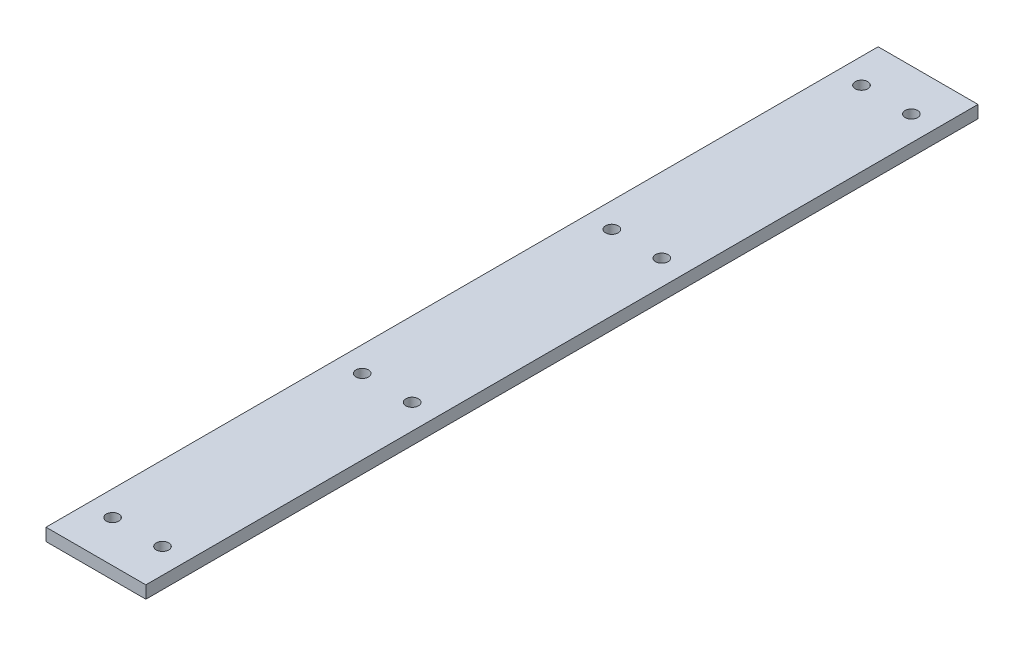
ISO-10303-21;
HEADER;
FILE_DESCRIPTION(('STEP AP214'),'2;1');
FILE_NAME('part.step','',(''),(''),'','','');
FILE_SCHEMA(('AUTOMOTIVE_DESIGN { 1 0 10303 214 1 1 1 1 }'));
ENDSEC;
DATA;
#1=APPLICATION_CONTEXT('core data for automotive mechanical design processes');
#2=APPLICATION_PROTOCOL_DEFINITION('international standard','automotive_design',2000,#1);
#3=PRODUCT_CONTEXT('',#1,'mechanical');
#4=PRODUCT('Part','Part','',(#3));
#5=PRODUCT_RELATED_PRODUCT_CATEGORY('part','',(#4));
#6=PRODUCT_DEFINITION_FORMATION('','',#4);
#7=PRODUCT_DEFINITION_CONTEXT('part definition',#1,'design');
#8=PRODUCT_DEFINITION('design','',#6,#7);
#9=PRODUCT_DEFINITION_SHAPE('','',#8);
#10=(LENGTH_UNIT() NAMED_UNIT(*) SI_UNIT(.MILLI.,.METRE.));
#11=(NAMED_UNIT(*) PLANE_ANGLE_UNIT() SI_UNIT($,.RADIAN.));
#12=(NAMED_UNIT(*) SI_UNIT($,.STERADIAN.) SOLID_ANGLE_UNIT());
#13=UNCERTAINTY_MEASURE_WITH_UNIT(LENGTH_MEASURE(1.E-05),#10,'distance_accuracy_value','');
#14=(GEOMETRIC_REPRESENTATION_CONTEXT(3) GLOBAL_UNCERTAINTY_ASSIGNED_CONTEXT((#13)) GLOBAL_UNIT_ASSIGNED_CONTEXT((#10,
#11,#12)) REPRESENTATION_CONTEXT('',''));
#15=CARTESIAN_POINT('',(0.,0.,0.));
#16=DIRECTION('',(0.,0.,1.));
#17=DIRECTION('',(1.,0.,0.));
#18=AXIS2_PLACEMENT_3D('',#15,#16,#17);
#19=CARTESIAN_POINT('',(0.,0.,0.));
#20=DIRECTION('',(0.,1.,0.));
#21=DIRECTION('',(1.,0.,0.));
#22=AXIS2_PLACEMENT_3D('',#19,#20,#21);
#23=PLANE('',#22);
#24=DIRECTION('',(0.,0.,-1.));
#25=VECTOR('',#24,1.);
#26=CARTESIAN_POINT('',(12.,0.,100.));
#27=LINE('',#26,#25);
#28=CARTESIAN_POINT('',(12.,0.,100.));
#29=VERTEX_POINT('',#28);
#30=CARTESIAN_POINT('',(12.,0.,-100.));
#31=VERTEX_POINT('',#30);
#32=EDGE_CURVE('E138',#29,#31,#27,.T.);
#33=ORIENTED_EDGE('',*,*,#32,.T.);
#34=DIRECTION('',(-1.,0.,0.));
#35=VECTOR('',#34,1.);
#36=CARTESIAN_POINT('',(12.,0.,-100.));
#37=LINE('',#36,#35);
#38=CARTESIAN_POINT('',(-12.,0.,-100.));
#39=VERTEX_POINT('',#38);
#40=EDGE_CURVE('E181',#31,#39,#37,.T.);
#41=ORIENTED_EDGE('',*,*,#40,.T.);
#42=DIRECTION('',(0.,0.,1.));
#43=VECTOR('',#42,1.);
#44=CARTESIAN_POINT('',(-12.,0.,-100.));
#45=LINE('',#44,#43);
#46=CARTESIAN_POINT('',(-12.,0.,100.));
#47=VERTEX_POINT('',#46);
#48=EDGE_CURVE('E139',#39,#47,#45,.T.);
#49=ORIENTED_EDGE('',*,*,#48,.T.);
#50=DIRECTION('',(1.,0.,0.));
#51=VECTOR('',#50,1.);
#52=CARTESIAN_POINT('',(-12.,0.,100.));
#53=LINE('',#52,#51);
#54=EDGE_CURVE('E26',#47,#29,#53,.T.);
#55=ORIENTED_EDGE('',*,*,#54,.T.);
#56=EDGE_LOOP('',(#33,#41,#49,#55));
#57=FACE_BOUND('',#56,.T.);
#58=CARTESIAN_POINT('',(6.,0.,-30.));
#59=DIRECTION('',(0.,-1.,0.));
#60=DIRECTION('',(1.,0.,0.));
#61=AXIS2_PLACEMENT_3D('',#58,#59,#60);
#62=CIRCLE('',#61,1.5);
#63=CARTESIAN_POINT('',(7.5,0.,-30.));
#64=VERTEX_POINT('',#63);
#65=EDGE_CURVE('E165',#64,#64,#62,.T.);
#66=ORIENTED_EDGE('',*,*,#65,.T.);
#67=EDGE_LOOP('',(#66));
#68=FACE_BOUND('',#67,.T.);
#69=CARTESIAN_POINT('',(6.,0.,30.));
#70=DIRECTION('',(0.,-1.,0.));
#71=DIRECTION('',(1.,0.,0.));
#72=AXIS2_PLACEMENT_3D('',#69,#70,#71);
#73=CIRCLE('',#72,1.5);
#74=CARTESIAN_POINT('',(7.5,0.,30.));
#75=VERTEX_POINT('',#74);
#76=EDGE_CURVE('E200',#75,#75,#73,.T.);
#77=ORIENTED_EDGE('',*,*,#76,.T.);
#78=EDGE_LOOP('',(#77));
#79=FACE_BOUND('',#78,.T.);
#80=CARTESIAN_POINT('',(6.,0.,90.));
#81=DIRECTION('',(0.,-1.,0.));
#82=DIRECTION('',(1.,0.,0.));
#83=AXIS2_PLACEMENT_3D('',#80,#81,#82);
#84=CIRCLE('',#83,1.5);
#85=CARTESIAN_POINT('',(7.5,0.,90.));
#86=VERTEX_POINT('',#85);
#87=EDGE_CURVE('E172',#86,#86,#84,.T.);
#88=ORIENTED_EDGE('',*,*,#87,.T.);
#89=EDGE_LOOP('',(#88));
#90=FACE_BOUND('',#89,.T.);
#91=CARTESIAN_POINT('',(6.,0.,-90.));
#92=DIRECTION('',(0.,-1.,0.));
#93=DIRECTION('',(1.,0.,0.));
#94=AXIS2_PLACEMENT_3D('',#91,#92,#93);
#95=CIRCLE('',#94,1.5);
#96=CARTESIAN_POINT('',(7.5,0.,-90.));
#97=VERTEX_POINT('',#96);
#98=EDGE_CURVE('E207',#97,#97,#95,.T.);
#99=ORIENTED_EDGE('',*,*,#98,.T.);
#100=EDGE_LOOP('',(#99));
#101=FACE_BOUND('',#100,.T.);
#102=CARTESIAN_POINT('',(-6.,0.,90.));
#103=DIRECTION('',(0.,-1.,0.));
#104=DIRECTION('',(1.,0.,0.));
#105=AXIS2_PLACEMENT_3D('',#102,#103,#104);
#106=CIRCLE('',#105,1.5);
#107=CARTESIAN_POINT('',(-4.5,0.,90.));
#108=VERTEX_POINT('',#107);
#109=EDGE_CURVE('E213',#108,#108,#106,.T.);
#110=ORIENTED_EDGE('',*,*,#109,.T.);
#111=EDGE_LOOP('',(#110));
#112=FACE_BOUND('',#111,.T.);
#113=CARTESIAN_POINT('',(-6.,0.,30.));
#114=DIRECTION('',(0.,-1.,0.));
#115=DIRECTION('',(1.,0.,0.));
#116=AXIS2_PLACEMENT_3D('',#113,#114,#115);
#117=CIRCLE('',#116,1.5);
#118=CARTESIAN_POINT('',(-4.5,0.,30.));
#119=VERTEX_POINT('',#118);
#120=EDGE_CURVE('E219',#119,#119,#117,.T.);
#121=ORIENTED_EDGE('',*,*,#120,.T.);
#122=EDGE_LOOP('',(#121));
#123=FACE_BOUND('',#122,.T.);
#124=CARTESIAN_POINT('',(-6.,0.,-30.));
#125=DIRECTION('',(0.,-1.,0.));
#126=DIRECTION('',(1.,0.,0.));
#127=AXIS2_PLACEMENT_3D('',#124,#125,#126);
#128=CIRCLE('',#127,1.5);
#129=CARTESIAN_POINT('',(-4.5,0.,-30.));
#130=VERTEX_POINT('',#129);
#131=EDGE_CURVE('E225',#130,#130,#128,.T.);
#132=ORIENTED_EDGE('',*,*,#131,.T.);
#133=EDGE_LOOP('',(#132));
#134=FACE_BOUND('',#133,.T.);
#135=CARTESIAN_POINT('',(-6.,0.,-90.));
#136=DIRECTION('',(0.,-1.,0.));
#137=DIRECTION('',(1.,0.,0.));
#138=AXIS2_PLACEMENT_3D('',#135,#136,#137);
#139=CIRCLE('',#138,1.5);
#140=CARTESIAN_POINT('',(-4.5,0.,-90.));
#141=VERTEX_POINT('',#140);
#142=EDGE_CURVE('E36',#141,#141,#139,.T.);
#143=ORIENTED_EDGE('',*,*,#142,.T.);
#144=EDGE_LOOP('',(#143));
#145=FACE_BOUND('',#144,.T.);
#146=ADVANCED_FACE('F17',(#57,#68,#79,#90,#101,#112,#123,#134,#145),#23,.T.);
#147=CARTESIAN_POINT('',(0.,-3.,0.));
#148=DIRECTION('',(0.,1.,0.));
#149=DIRECTION('',(1.,0.,0.));
#150=AXIS2_PLACEMENT_3D('',#147,#148,#149);
#151=PLANE('',#150);
#152=DIRECTION('',(0.,0.,-1.));
#153=VECTOR('',#152,1.);
#154=CARTESIAN_POINT('',(12.,-3.,100.));
#155=LINE('',#154,#153);
#156=CARTESIAN_POINT('',(12.,-3.,100.));
#157=VERTEX_POINT('',#156);
#158=CARTESIAN_POINT('',(12.,-3.,-100.));
#159=VERTEX_POINT('',#158);
#160=EDGE_CURVE('E151',#157,#159,#155,.T.);
#161=ORIENTED_EDGE('',*,*,#160,.F.);
#162=DIRECTION('',(1.,0.,0.));
#163=VECTOR('',#162,1.);
#164=CARTESIAN_POINT('',(-12.,-3.,100.));
#165=LINE('',#164,#163);
#166=CARTESIAN_POINT('',(-12.,-3.,100.));
#167=VERTEX_POINT('',#166);
#168=EDGE_CURVE('E11',#167,#157,#165,.T.);
#169=ORIENTED_EDGE('',*,*,#168,.F.);
#170=DIRECTION('',(0.,0.,1.));
#171=VECTOR('',#170,1.);
#172=CARTESIAN_POINT('',(-12.,-3.,-100.));
#173=LINE('',#172,#171);
#174=CARTESIAN_POINT('',(-12.,-3.,-100.));
#175=VERTEX_POINT('',#174);
#176=EDGE_CURVE('E191',#175,#167,#173,.T.);
#177=ORIENTED_EDGE('',*,*,#176,.F.);
#178=DIRECTION('',(-1.,0.,0.));
#179=VECTOR('',#178,1.);
#180=CARTESIAN_POINT('',(12.,-3.,-100.));
#181=LINE('',#180,#179);
#182=EDGE_CURVE('E176',#159,#175,#181,.T.);
#183=ORIENTED_EDGE('',*,*,#182,.F.);
#184=EDGE_LOOP('',(#161,#169,#177,#183));
#185=FACE_BOUND('',#184,.T.);
#186=CARTESIAN_POINT('',(6.,-3.,-30.));
#187=DIRECTION('',(0.,-1.,0.));
#188=DIRECTION('',(1.,0.,0.));
#189=AXIS2_PLACEMENT_3D('',#186,#187,#188);
#190=CIRCLE('',#189,1.5);
#191=CARTESIAN_POINT('',(7.5,-3.,-30.));
#192=VERTEX_POINT('',#191);
#193=EDGE_CURVE('E169',#192,#192,#190,.T.);
#194=ORIENTED_EDGE('',*,*,#193,.F.);
#195=EDGE_LOOP('',(#194));
#196=FACE_BOUND('',#195,.T.);
#197=CARTESIAN_POINT('',(6.,-3.,30.));
#198=DIRECTION('',(0.,-1.,0.));
#199=DIRECTION('',(1.,0.,0.));
#200=AXIS2_PLACEMENT_3D('',#197,#198,#199);
#201=CIRCLE('',#200,1.5);
#202=CARTESIAN_POINT('',(7.5,-3.,30.));
#203=VERTEX_POINT('',#202);
#204=EDGE_CURVE('E168',#203,#203,#201,.T.);
#205=ORIENTED_EDGE('',*,*,#204,.F.);
#206=EDGE_LOOP('',(#205));
#207=FACE_BOUND('',#206,.T.);
#208=CARTESIAN_POINT('',(6.,-3.,90.));
#209=DIRECTION('',(0.,-1.,0.));
#210=DIRECTION('',(1.,0.,0.));
#211=AXIS2_PLACEMENT_3D('',#208,#209,#210);
#212=CIRCLE('',#211,1.5);
#213=CARTESIAN_POINT('',(7.5,-3.,90.));
#214=VERTEX_POINT('',#213);
#215=EDGE_CURVE('E163',#214,#214,#212,.T.);
#216=ORIENTED_EDGE('',*,*,#215,.F.);
#217=EDGE_LOOP('',(#216));
#218=FACE_BOUND('',#217,.T.);
#219=CARTESIAN_POINT('',(6.,-3.,-90.));
#220=DIRECTION('',(0.,-1.,0.));
#221=DIRECTION('',(1.,0.,0.));
#222=AXIS2_PLACEMENT_3D('',#219,#220,#221);
#223=CIRCLE('',#222,1.5);
#224=CARTESIAN_POINT('',(7.5,-3.,-90.));
#225=VERTEX_POINT('',#224);
#226=EDGE_CURVE('E175',#225,#225,#223,.T.);
#227=ORIENTED_EDGE('',*,*,#226,.F.);
#228=EDGE_LOOP('',(#227));
#229=FACE_BOUND('',#228,.T.);
#230=CARTESIAN_POINT('',(-6.,-3.,90.));
#231=DIRECTION('',(0.,-1.,0.));
#232=DIRECTION('',(1.,0.,0.));
#233=AXIS2_PLACEMENT_3D('',#230,#231,#232);
#234=CIRCLE('',#233,1.5);
#235=CARTESIAN_POINT('',(-4.5,-3.,90.));
#236=VERTEX_POINT('',#235);
#237=EDGE_CURVE('E210',#236,#236,#234,.T.);
#238=ORIENTED_EDGE('',*,*,#237,.F.);
#239=EDGE_LOOP('',(#238));
#240=FACE_BOUND('',#239,.T.);
#241=CARTESIAN_POINT('',(-6.,-3.,30.));
#242=DIRECTION('',(0.,-1.,0.));
#243=DIRECTION('',(1.,0.,0.));
#244=AXIS2_PLACEMENT_3D('',#241,#242,#243);
#245=CIRCLE('',#244,1.5);
#246=CARTESIAN_POINT('',(-4.5,-3.,30.));
#247=VERTEX_POINT('',#246);
#248=EDGE_CURVE('E216',#247,#247,#245,.T.);
#249=ORIENTED_EDGE('',*,*,#248,.F.);
#250=EDGE_LOOP('',(#249));
#251=FACE_BOUND('',#250,.T.);
#252=CARTESIAN_POINT('',(-6.,-3.,-30.));
#253=DIRECTION('',(0.,-1.,0.));
#254=DIRECTION('',(1.,0.,0.));
#255=AXIS2_PLACEMENT_3D('',#252,#253,#254);
#256=CIRCLE('',#255,1.5);
#257=CARTESIAN_POINT('',(-4.5,-3.,-30.));
#258=VERTEX_POINT('',#257);
#259=EDGE_CURVE('E222',#258,#258,#256,.T.);
#260=ORIENTED_EDGE('',*,*,#259,.F.);
#261=EDGE_LOOP('',(#260));
#262=FACE_BOUND('',#261,.T.);
#263=CARTESIAN_POINT('',(-6.,-3.,-90.));
#264=DIRECTION('',(0.,-1.,0.));
#265=DIRECTION('',(1.,0.,0.));
#266=AXIS2_PLACEMENT_3D('',#263,#264,#265);
#267=CIRCLE('',#266,1.5);
#268=CARTESIAN_POINT('',(-4.5,-3.,-90.));
#269=VERTEX_POINT('',#268);
#270=EDGE_CURVE('E43',#269,#269,#267,.T.);
#271=ORIENTED_EDGE('',*,*,#270,.F.);
#272=EDGE_LOOP('',(#271));
#273=FACE_BOUND('',#272,.T.);
#274=ADVANCED_FACE('F19',(#185,#196,#207,#218,#229,#240,#251,#262,#273),#151,.F.);
#275=CARTESIAN_POINT('',(-12.,-3.,100.));
#276=DIRECTION('',(0.,0.,1.));
#277=DIRECTION('',(1.,0.,0.));
#278=AXIS2_PLACEMENT_3D('',#275,#276,#277);
#279=PLANE('',#278);
#280=ORIENTED_EDGE('',*,*,#54,.F.);
#281=DIRECTION('',(0.,1.,0.));
#282=VECTOR('',#281,1.);
#283=CARTESIAN_POINT('',(-12.,-3.,100.));
#284=LINE('',#283,#282);
#285=EDGE_CURVE('E195',#167,#47,#284,.T.);
#286=ORIENTED_EDGE('',*,*,#285,.F.);
#287=ORIENTED_EDGE('',*,*,#168,.T.);
#288=DIRECTION('',(0.,1.,0.));
#289=VECTOR('',#288,1.);
#290=CARTESIAN_POINT('',(12.,-3.,100.));
#291=LINE('',#290,#289);
#292=EDGE_CURVE('E145',#157,#29,#291,.T.);
#293=ORIENTED_EDGE('',*,*,#292,.T.);
#294=EDGE_LOOP('',(#280,#286,#287,#293));
#295=FACE_BOUND('',#294,.T.);
#296=ADVANCED_FACE('F146',(#295),#279,.T.);
#297=CARTESIAN_POINT('',(-6.,-3.,-90.));
#298=DIRECTION('',(0.,1.,0.));
#299=DIRECTION('',(0.,0.,1.));
#300=AXIS2_PLACEMENT_3D('',#297,#298,#299);
#301=CYLINDRICAL_SURFACE('',#300,1.5);
#302=ORIENTED_EDGE('',*,*,#142,.F.);
#303=EDGE_LOOP('',(#302));
#304=FACE_BOUND('',#303,.T.);
#305=ORIENTED_EDGE('',*,*,#270,.T.);
#306=EDGE_LOOP('',(#305));
#307=FACE_BOUND('',#306,.T.);
#308=ADVANCED_FACE('F332',(#304,#307),#301,.F.);
#309=CARTESIAN_POINT('',(-6.,-3.,-30.));
#310=DIRECTION('',(0.,1.,0.));
#311=DIRECTION('',(0.,0.,1.));
#312=AXIS2_PLACEMENT_3D('',#309,#310,#311);
#313=CYLINDRICAL_SURFACE('',#312,1.5);
#314=ORIENTED_EDGE('',*,*,#131,.F.);
#315=EDGE_LOOP('',(#314));
#316=FACE_BOUND('',#315,.T.);
#317=ORIENTED_EDGE('',*,*,#259,.T.);
#318=EDGE_LOOP('',(#317));
#319=FACE_BOUND('',#318,.T.);
#320=ADVANCED_FACE('F329',(#316,#319),#313,.F.);
#321=CARTESIAN_POINT('',(-6.,-3.,30.));
#322=DIRECTION('',(0.,1.,0.));
#323=DIRECTION('',(0.,0.,1.));
#324=AXIS2_PLACEMENT_3D('',#321,#322,#323);
#325=CYLINDRICAL_SURFACE('',#324,1.5);
#326=ORIENTED_EDGE('',*,*,#120,.F.);
#327=EDGE_LOOP('',(#326));
#328=FACE_BOUND('',#327,.T.);
#329=ORIENTED_EDGE('',*,*,#248,.T.);
#330=EDGE_LOOP('',(#329));
#331=FACE_BOUND('',#330,.T.);
#332=ADVANCED_FACE('F331',(#328,#331),#325,.F.);
#333=CARTESIAN_POINT('',(-6.,-3.,90.));
#334=DIRECTION('',(0.,1.,0.));
#335=DIRECTION('',(0.,0.,1.));
#336=AXIS2_PLACEMENT_3D('',#333,#334,#335);
#337=CYLINDRICAL_SURFACE('',#336,1.5);
#338=ORIENTED_EDGE('',*,*,#109,.F.);
#339=EDGE_LOOP('',(#338));
#340=FACE_BOUND('',#339,.T.);
#341=ORIENTED_EDGE('',*,*,#237,.T.);
#342=EDGE_LOOP('',(#341));
#343=FACE_BOUND('',#342,.T.);
#344=ADVANCED_FACE('F340',(#340,#343),#337,.F.);
#345=CARTESIAN_POINT('',(6.,-3.,-90.));
#346=DIRECTION('',(0.,1.,0.));
#347=DIRECTION('',(0.,0.,1.));
#348=AXIS2_PLACEMENT_3D('',#345,#346,#347);
#349=CYLINDRICAL_SURFACE('',#348,1.5);
#350=ORIENTED_EDGE('',*,*,#98,.F.);
#351=EDGE_LOOP('',(#350));
#352=FACE_BOUND('',#351,.T.);
#353=ORIENTED_EDGE('',*,*,#226,.T.);
#354=EDGE_LOOP('',(#353));
#355=FACE_BOUND('',#354,.T.);
#356=ADVANCED_FACE('F353',(#352,#355),#349,.F.);
#357=CARTESIAN_POINT('',(6.,-3.,90.));
#358=DIRECTION('',(0.,1.,0.));
#359=DIRECTION('',(0.,0.,1.));
#360=AXIS2_PLACEMENT_3D('',#357,#358,#359);
#361=CYLINDRICAL_SURFACE('',#360,1.5);
#362=ORIENTED_EDGE('',*,*,#87,.F.);
#363=EDGE_LOOP('',(#362));
#364=FACE_BOUND('',#363,.T.);
#365=ORIENTED_EDGE('',*,*,#215,.T.);
#366=EDGE_LOOP('',(#365));
#367=FACE_BOUND('',#366,.T.);
#368=ADVANCED_FACE('F315',(#364,#367),#361,.F.);
#369=CARTESIAN_POINT('',(6.,-3.,30.));
#370=DIRECTION('',(0.,1.,0.));
#371=DIRECTION('',(0.,0.,1.));
#372=AXIS2_PLACEMENT_3D('',#369,#370,#371);
#373=CYLINDRICAL_SURFACE('',#372,1.5);
#374=ORIENTED_EDGE('',*,*,#76,.F.);
#375=EDGE_LOOP('',(#374));
#376=FACE_BOUND('',#375,.T.);
#377=ORIENTED_EDGE('',*,*,#204,.T.);
#378=EDGE_LOOP('',(#377));
#379=FACE_BOUND('',#378,.T.);
#380=ADVANCED_FACE('F370',(#376,#379),#373,.F.);
#381=CARTESIAN_POINT('',(6.,-3.,-30.));
#382=DIRECTION('',(0.,1.,0.));
#383=DIRECTION('',(0.,0.,1.));
#384=AXIS2_PLACEMENT_3D('',#381,#382,#383);
#385=CYLINDRICAL_SURFACE('',#384,1.5);
#386=ORIENTED_EDGE('',*,*,#65,.F.);
#387=EDGE_LOOP('',(#386));
#388=FACE_BOUND('',#387,.T.);
#389=ORIENTED_EDGE('',*,*,#193,.T.);
#390=EDGE_LOOP('',(#389));
#391=FACE_BOUND('',#390,.T.);
#392=ADVANCED_FACE('F376',(#388,#391),#385,.F.);
#393=CARTESIAN_POINT('',(-12.,-3.,-100.));
#394=DIRECTION('',(-1.,0.,0.));
#395=DIRECTION('',(0.,0.,1.));
#396=AXIS2_PLACEMENT_3D('',#393,#394,#395);
#397=PLANE('',#396);
#398=ORIENTED_EDGE('',*,*,#48,.F.);
#399=DIRECTION('',(0.,1.,0.));
#400=VECTOR('',#399,1.);
#401=CARTESIAN_POINT('',(-12.,-3.,-100.));
#402=LINE('',#401,#400);
#403=EDGE_CURVE('E180',#175,#39,#402,.T.);
#404=ORIENTED_EDGE('',*,*,#403,.F.);
#405=ORIENTED_EDGE('',*,*,#176,.T.);
#406=ORIENTED_EDGE('',*,*,#285,.T.);
#407=EDGE_LOOP('',(#398,#404,#405,#406));
#408=FACE_BOUND('',#407,.T.);
#409=ADVANCED_FACE('F379',(#408),#397,.T.);
#410=CARTESIAN_POINT('',(12.,-3.,-100.));
#411=DIRECTION('',(0.,0.,-1.));
#412=DIRECTION('',(0.,-1.,0.));
#413=AXIS2_PLACEMENT_3D('',#410,#411,#412);
#414=PLANE('',#413);
#415=ORIENTED_EDGE('',*,*,#40,.F.);
#416=DIRECTION('',(0.,1.,0.));
#417=VECTOR('',#416,1.);
#418=CARTESIAN_POINT('',(12.,-3.,-100.));
#419=LINE('',#418,#417);
#420=EDGE_CURVE('E156',#159,#31,#419,.T.);
#421=ORIENTED_EDGE('',*,*,#420,.F.);
#422=ORIENTED_EDGE('',*,*,#182,.T.);
#423=ORIENTED_EDGE('',*,*,#403,.T.);
#424=EDGE_LOOP('',(#415,#421,#422,#423));
#425=FACE_BOUND('',#424,.T.);
#426=ADVANCED_FACE('F385',(#425),#414,.T.);
#427=CARTESIAN_POINT('',(12.,-3.,100.));
#428=DIRECTION('',(1.,0.,0.));
#429=DIRECTION('',(0.,1.,0.));
#430=AXIS2_PLACEMENT_3D('',#427,#428,#429);
#431=PLANE('',#430);
#432=ORIENTED_EDGE('',*,*,#32,.F.);
#433=ORIENTED_EDGE('',*,*,#292,.F.);
#434=ORIENTED_EDGE('',*,*,#160,.T.);
#435=ORIENTED_EDGE('',*,*,#420,.T.);
#436=EDGE_LOOP('',(#432,#433,#434,#435));
#437=FACE_BOUND('',#436,.T.);
#438=ADVANCED_FACE('F154',(#437),#431,.T.);
#439=CLOSED_SHELL('',(#146,#274,#296,#308,#320,#332,#344,#356,#368,#380,#392,#409,#426,#438));
#440=MANIFOLD_SOLID_BREP('B1',#439);
#441=ADVANCED_BREP_SHAPE_REPRESENTATION('',(#18,#440),#14);
#442=SHAPE_DEFINITION_REPRESENTATION(#9,#441);
ENDSEC;
END-ISO-10303-21;
